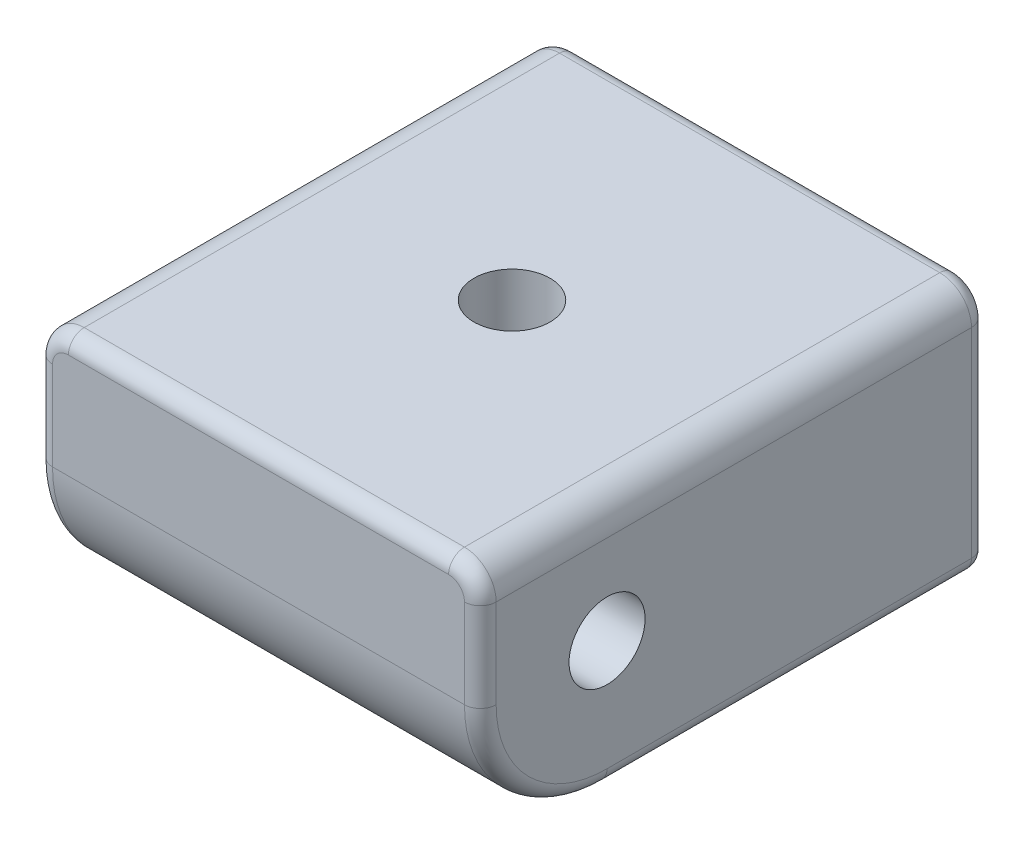
ISO-10303-21;
HEADER;
FILE_DESCRIPTION(('STEP AP214'),'2;1');
FILE_NAME('part.step','',(''),(''),'','','');
FILE_SCHEMA(('AUTOMOTIVE_DESIGN { 1 0 10303 214 1 1 1 1 }'));
ENDSEC;
DATA;
#1=APPLICATION_CONTEXT('core data for automotive mechanical design processes');
#2=APPLICATION_PROTOCOL_DEFINITION('international standard','automotive_design',2000,#1);
#3=PRODUCT_CONTEXT('',#1,'mechanical');
#4=PRODUCT('Part','Part','',(#3));
#5=PRODUCT_RELATED_PRODUCT_CATEGORY('part','',(#4));
#6=PRODUCT_DEFINITION_FORMATION('','',#4);
#7=PRODUCT_DEFINITION_CONTEXT('part definition',#1,'design');
#8=PRODUCT_DEFINITION('design','',#6,#7);
#9=PRODUCT_DEFINITION_SHAPE('','',#8);
#10=(LENGTH_UNIT() NAMED_UNIT(*) SI_UNIT(.MILLI.,.METRE.));
#11=(NAMED_UNIT(*) PLANE_ANGLE_UNIT() SI_UNIT($,.RADIAN.));
#12=(NAMED_UNIT(*) SI_UNIT($,.STERADIAN.) SOLID_ANGLE_UNIT());
#13=UNCERTAINTY_MEASURE_WITH_UNIT(LENGTH_MEASURE(1.E-05),#10,'distance_accuracy_value','');
#14=(GEOMETRIC_REPRESENTATION_CONTEXT(3) GLOBAL_UNCERTAINTY_ASSIGNED_CONTEXT((#13)) GLOBAL_UNIT_ASSIGNED_CONTEXT((#10,
#11,#12)) REPRESENTATION_CONTEXT('',''));
#15=CARTESIAN_POINT('',(0.,0.,0.));
#16=DIRECTION('',(0.,0.,1.));
#17=DIRECTION('',(1.,0.,0.));
#18=AXIS2_PLACEMENT_3D('',#15,#16,#17);
#19=CARTESIAN_POINT('',(-11.1125,10.8077,12.7));
#20=DIRECTION('',(1.,0.,0.));
#21=DIRECTION('',(0.,0.,-1.));
#22=AXIS2_PLACEMENT_3D('',#19,#20,#21);
#23=PLANE('',#22);
#24=CARTESIAN_POINT('',(-11.1125,6.34999999999999,19.05));
#25=DIRECTION('',(1.,0.,0.));
#26=DIRECTION('',(0.,0.,-1.));
#27=AXIS2_PLACEMENT_3D('',#24,#25,#26);
#28=CIRCLE('',#27,1.905);
#29=CARTESIAN_POINT('',(-11.1125,6.34999999999999,17.145));
#30=VERTEX_POINT('',#29);
#31=EDGE_CURVE('E430',#30,#30,#28,.F.);
#32=ORIENTED_EDGE('',*,*,#31,.F.);
#33=EDGE_LOOP('',(#32));
#34=FACE_BOUND('',#33,.T.);
#35=CARTESIAN_POINT('',(-11.1125,6.35,19.05));
#36=DIRECTION('',(1.,0.,0.));
#37=DIRECTION('',(0.,0.,-1.));
#38=AXIS2_PLACEMENT_3D('',#35,#36,#37);
#39=CIRCLE('',#38,5.55625);
#40=CARTESIAN_POINT('',(-11.1125,6.35,24.60625));
#41=VERTEX_POINT('',#40);
#42=CARTESIAN_POINT('',(-11.1125,0.793749999999999,19.05));
#43=VERTEX_POINT('',#42);
#44=EDGE_CURVE('E284',#41,#43,#39,.T.);
#45=ORIENTED_EDGE('',*,*,#44,.F.);
#46=DIRECTION('',(0.,-1.,0.));
#47=VECTOR('',#46,1.);
#48=CARTESIAN_POINT('',(-11.1125,10.8077,24.60625));
#49=LINE('',#48,#47);
#50=CARTESIAN_POINT('',(-11.1125,10.8077,24.60625));
#51=VERTEX_POINT('',#50);
#52=EDGE_CURVE('E327',#41,#51,#49,.F.);
#53=ORIENTED_EDGE('',*,*,#52,.T.);
#54=DIRECTION('',(0.,0.,-1.));
#55=VECTOR('',#54,1.);
#56=CARTESIAN_POINT('',(-11.1125,10.8077,12.7));
#57=LINE('',#56,#55);
#58=CARTESIAN_POINT('',(-11.1125,10.8077,0.793749999999999));
#59=VERTEX_POINT('',#58);
#60=EDGE_CURVE('E391',#51,#59,#57,.T.);
#61=ORIENTED_EDGE('',*,*,#60,.T.);
#62=DIRECTION('',(0.,-1.,0.));
#63=VECTOR('',#62,1.);
#64=CARTESIAN_POINT('',(-11.1125,10.8077,0.793749999999999));
#65=LINE('',#64,#63);
#66=CARTESIAN_POINT('',(-11.1125,0.79375,0.793749999999999));
#67=VERTEX_POINT('',#66);
#68=EDGE_CURVE('E322',#59,#67,#65,.T.);
#69=ORIENTED_EDGE('',*,*,#68,.T.);
#70=DIRECTION('',(0.,0.,-1.));
#71=VECTOR('',#70,1.);
#72=CARTESIAN_POINT('',(-11.1125,0.793749999999999,12.7));
#73=LINE('',#72,#71);
#74=EDGE_CURVE('E316',#67,#43,#73,.F.);
#75=ORIENTED_EDGE('',*,*,#74,.T.);
#76=EDGE_LOOP('',(#45,#53,#61,#69,#75));
#77=FACE_BOUND('',#76,.T.);
#78=ADVANCED_FACE('F49',(#34,#77),#23,.F.);
#79=CARTESIAN_POINT('',(11.1125,0.,12.7));
#80=DIRECTION('',(-1.,0.,0.));
#81=DIRECTION('',(0.,-1.,0.));
#82=AXIS2_PLACEMENT_3D('',#79,#80,#81);
#83=PLANE('',#82);
#84=CARTESIAN_POINT('',(11.1125,6.35,19.05));
#85=DIRECTION('',(1.,0.,0.));
#86=DIRECTION('',(0.,1.,0.));
#87=AXIS2_PLACEMENT_3D('',#84,#85,#86);
#88=CIRCLE('',#87,1.905);
#89=CARTESIAN_POINT('',(11.1125,8.255,19.05));
#90=VERTEX_POINT('',#89);
#91=EDGE_CURVE('E433',#90,#90,#88,.T.);
#92=ORIENTED_EDGE('',*,*,#91,.F.);
#93=EDGE_LOOP('',(#92));
#94=FACE_BOUND('',#93,.T.);
#95=CARTESIAN_POINT('',(11.1125,6.35,19.05));
#96=DIRECTION('',(-1.,0.,0.));
#97=DIRECTION('',(0.,-1.,0.));
#98=AXIS2_PLACEMENT_3D('',#95,#96,#97);
#99=CIRCLE('',#98,5.55625);
#100=CARTESIAN_POINT('',(11.1125,0.79375,19.05));
#101=VERTEX_POINT('',#100);
#102=CARTESIAN_POINT('',(11.1125,6.35,24.60625));
#103=VERTEX_POINT('',#102);
#104=EDGE_CURVE('E273',#101,#103,#99,.T.);
#105=ORIENTED_EDGE('',*,*,#104,.F.);
#106=DIRECTION('',(0.,0.,-1.));
#107=VECTOR('',#106,1.);
#108=CARTESIAN_POINT('',(11.1125,0.79375,12.7));
#109=LINE('',#108,#107);
#110=CARTESIAN_POINT('',(11.1125,0.79375,0.793749999999999));
#111=VERTEX_POINT('',#110);
#112=EDGE_CURVE('E401',#101,#111,#109,.T.);
#113=ORIENTED_EDGE('',*,*,#112,.T.);
#114=DIRECTION('',(0.,1.,0.));
#115=VECTOR('',#114,1.);
#116=CARTESIAN_POINT('',(11.1125,0.,0.793749999999999));
#117=LINE('',#116,#115);
#118=CARTESIAN_POINT('',(11.1125,10.8077,0.793749999999999));
#119=VERTEX_POINT('',#118);
#120=EDGE_CURVE('E404',#111,#119,#117,.T.);
#121=ORIENTED_EDGE('',*,*,#120,.T.);
#122=DIRECTION('',(0.,0.,-1.));
#123=VECTOR('',#122,1.);
#124=CARTESIAN_POINT('',(11.1125,10.8077,12.7));
#125=LINE('',#124,#123);
#126=CARTESIAN_POINT('',(11.1125,10.8077,24.60625));
#127=VERTEX_POINT('',#126);
#128=EDGE_CURVE('E215',#127,#119,#125,.T.);
#129=ORIENTED_EDGE('',*,*,#128,.F.);
#130=DIRECTION('',(0.,1.,0.));
#131=VECTOR('',#130,1.);
#132=CARTESIAN_POINT('',(11.1125,0.,24.60625));
#133=LINE('',#132,#131);
#134=EDGE_CURVE('E407',#127,#103,#133,.F.);
#135=ORIENTED_EDGE('',*,*,#134,.T.);
#136=EDGE_LOOP('',(#105,#113,#121,#129,#135));
#137=FACE_BOUND('',#136,.T.);
#138=ADVANCED_FACE('F459',(#94,#137),#83,.F.);
#139=CARTESIAN_POINT('',(9.525,10.8077,0.));
#140=DIRECTION('',(0.,0.,1.));
#141=DIRECTION('',(1.,0.,0.));
#142=AXIS2_PLACEMENT_3D('',#139,#140,#141);
#143=PLANE('',#142);
#144=DIRECTION('',(0.,1.,0.));
#145=VECTOR('',#144,1.);
#146=CARTESIAN_POINT('',(10.31875,10.8077,0.));
#147=LINE('',#146,#145);
#148=CARTESIAN_POINT('',(10.31875,10.8077,0.));
#149=VERTEX_POINT('',#148);
#150=CARTESIAN_POINT('',(10.31875,0.79375,0.));
#151=VERTEX_POINT('',#150);
#152=EDGE_CURVE('E354',#149,#151,#147,.F.);
#153=ORIENTED_EDGE('',*,*,#152,.T.);
#154=DIRECTION('',(1.,0.,0.));
#155=VECTOR('',#154,1.);
#156=CARTESIAN_POINT('',(9.525,0.793749999999999,0.));
#157=LINE('',#156,#155);
#158=CARTESIAN_POINT('',(-10.31875,0.79375,0.));
#159=VERTEX_POINT('',#158);
#160=EDGE_CURVE('E358',#151,#159,#157,.F.);
#161=ORIENTED_EDGE('',*,*,#160,.T.);
#162=DIRECTION('',(0.,-1.,0.));
#163=VECTOR('',#162,1.);
#164=CARTESIAN_POINT('',(-10.31875,10.8077,0.));
#165=LINE('',#164,#163);
#166=CARTESIAN_POINT('',(-10.31875,10.8077,0.));
#167=VERTEX_POINT('',#166);
#168=EDGE_CURVE('E348',#159,#167,#165,.F.);
#169=ORIENTED_EDGE('',*,*,#168,.T.);
#170=CARTESIAN_POINT('',(-9.525,10.8077,0.));
#171=DIRECTION('',(0.,0.,1.));
#172=DIRECTION('',(1.,0.,0.));
#173=AXIS2_PLACEMENT_3D('',#170,#171,#172);
#174=CIRCLE('',#173,0.79375);
#175=CARTESIAN_POINT('',(-9.52499999999999,11.60145,0.));
#176=VERTEX_POINT('',#175);
#177=EDGE_CURVE('E345',#167,#176,#174,.F.);
#178=ORIENTED_EDGE('',*,*,#177,.T.);
#179=DIRECTION('',(-1.,0.,0.));
#180=VECTOR('',#179,1.);
#181=CARTESIAN_POINT('',(9.525,11.60145,0.));
#182=LINE('',#181,#180);
#183=CARTESIAN_POINT('',(9.52499999999999,11.60145,0.));
#184=VERTEX_POINT('',#183);
#185=EDGE_CURVE('E342',#176,#184,#182,.F.);
#186=ORIENTED_EDGE('',*,*,#185,.T.);
#187=CARTESIAN_POINT('',(9.525,10.8077,0.));
#188=DIRECTION('',(0.,0.,1.));
#189=DIRECTION('',(1.,0.,0.));
#190=AXIS2_PLACEMENT_3D('',#187,#188,#189);
#191=CIRCLE('',#190,0.79375);
#192=EDGE_CURVE('E351',#184,#149,#191,.F.);
#193=ORIENTED_EDGE('',*,*,#192,.T.);
#194=EDGE_LOOP('',(#153,#161,#169,#178,#186,#193));
#195=FACE_BOUND('',#194,.T.);
#196=CARTESIAN_POINT('',(-6.35,6.35,0.));
#197=DIRECTION('',(0.,0.,1.));
#198=DIRECTION('',(1.,0.,0.));
#199=AXIS2_PLACEMENT_3D('',#196,#197,#198);
#200=CIRCLE('',#199,1.905);
#201=CARTESIAN_POINT('',(-4.445,6.35,0.));
#202=VERTEX_POINT('',#201);
#203=EDGE_CURVE('E413',#202,#202,#200,.T.);
#204=ORIENTED_EDGE('',*,*,#203,.T.);
#205=EDGE_LOOP('',(#204));
#206=FACE_BOUND('',#205,.T.);
#207=CARTESIAN_POINT('',(6.35,6.35,0.));
#208=DIRECTION('',(0.,0.,1.));
#209=DIRECTION('',(1.,0.,0.));
#210=AXIS2_PLACEMENT_3D('',#207,#208,#209);
#211=CIRCLE('',#210,1.905);
#212=CARTESIAN_POINT('',(8.255,6.35,0.));
#213=VERTEX_POINT('',#212);
#214=EDGE_CURVE('E411',#213,#213,#211,.T.);
#215=ORIENTED_EDGE('',*,*,#214,.T.);
#216=EDGE_LOOP('',(#215));
#217=FACE_BOUND('',#216,.T.);
#218=ADVANCED_FACE('F456',(#195,#206,#217),#143,.F.);
#219=CARTESIAN_POINT('',(9.525,10.8077,12.7));
#220=DIRECTION('',(0.,0.,-1.));
#221=DIRECTION('',(-1.,0.,0.));
#222=AXIS2_PLACEMENT_3D('',#219,#220,#221);
#223=CYLINDRICAL_SURFACE('',#222,1.5875);
#224=DIRECTION('',(0.,0.,-1.));
#225=VECTOR('',#224,1.);
#226=CARTESIAN_POINT('',(9.52499999999998,12.3952,12.7));
#227=LINE('',#226,#225);
#228=CARTESIAN_POINT('',(9.52499999999998,12.3952,24.60625));
#229=VERTEX_POINT('',#228);
#230=CARTESIAN_POINT('',(9.52499999999998,12.3952,0.793749999999999));
#231=VERTEX_POINT('',#230);
#232=EDGE_CURVE('E376',#229,#231,#227,.T.);
#233=ORIENTED_EDGE('',*,*,#232,.F.);
#234=CARTESIAN_POINT('',(9.525,10.8077,24.60625));
#235=DIRECTION('',(0.,0.,1.));
#236=DIRECTION('',(1.,0.,0.));
#237=AXIS2_PLACEMENT_3D('',#234,#235,#236);
#238=CIRCLE('',#237,1.5875);
#239=EDGE_CURVE('E218',#229,#127,#238,.F.);
#240=ORIENTED_EDGE('',*,*,#239,.T.);
#241=ORIENTED_EDGE('',*,*,#128,.T.);
#242=CARTESIAN_POINT('',(9.525,10.8077,0.793749999999999));
#243=DIRECTION('',(0.,0.,1.));
#244=DIRECTION('',(1.,0.,0.));
#245=AXIS2_PLACEMENT_3D('',#242,#243,#244);
#246=CIRCLE('',#245,1.5875);
#247=EDGE_CURVE('E330',#119,#231,#246,.T.);
#248=ORIENTED_EDGE('',*,*,#247,.T.);
#249=EDGE_LOOP('',(#233,#240,#241,#248));
#250=FACE_BOUND('',#249,.T.);
#251=ADVANCED_FACE('F381',(#250),#223,.T.);
#252=CARTESIAN_POINT('',(9.52499999999998,12.3952,12.7));
#253=DIRECTION('',(0.,-1.,0.));
#254=DIRECTION('',(1.,0.,0.));
#255=AXIS2_PLACEMENT_3D('',#252,#253,#254);
#256=PLANE('',#255);
#257=CARTESIAN_POINT('',(0.,12.3952,12.7));
#258=DIRECTION('',(0.,1.,0.));
#259=DIRECTION('',(-1.,0.,0.));
#260=AXIS2_PLACEMENT_3D('',#257,#258,#259);
#261=CIRCLE('',#260,1.905);
#262=CARTESIAN_POINT('',(-1.905,12.3952,12.7));
#263=VERTEX_POINT('',#262);
#264=EDGE_CURVE('E272',#263,#263,#261,.T.);
#265=ORIENTED_EDGE('',*,*,#264,.F.);
#266=EDGE_LOOP('',(#265));
#267=FACE_BOUND('',#266,.T.);
#268=DIRECTION('',(0.,0.,-1.));
#269=VECTOR('',#268,1.);
#270=CARTESIAN_POINT('',(-9.52499999999999,12.3952,12.7));
#271=LINE('',#270,#269);
#272=CARTESIAN_POINT('',(-9.52499999999999,12.3952,24.60625));
#273=VERTEX_POINT('',#272);
#274=CARTESIAN_POINT('',(-9.52499999999999,12.3952,0.793749999999999));
#275=VERTEX_POINT('',#274);
#276=EDGE_CURVE('E379',#273,#275,#271,.T.);
#277=ORIENTED_EDGE('',*,*,#276,.F.);
#278=DIRECTION('',(-1.,0.,0.));
#279=VECTOR('',#278,1.);
#280=CARTESIAN_POINT('',(9.52499999999998,12.3952,24.60625));
#281=LINE('',#280,#279);
#282=EDGE_CURVE('E278',#273,#229,#281,.F.);
#283=ORIENTED_EDGE('',*,*,#282,.T.);
#284=ORIENTED_EDGE('',*,*,#232,.T.);
#285=DIRECTION('',(-1.,0.,0.));
#286=VECTOR('',#285,1.);
#287=CARTESIAN_POINT('',(9.52499999999998,12.3952,0.793749999999999));
#288=LINE('',#287,#286);
#289=EDGE_CURVE('E368',#231,#275,#288,.T.);
#290=ORIENTED_EDGE('',*,*,#289,.T.);
#291=EDGE_LOOP('',(#277,#283,#284,#290));
#292=FACE_BOUND('',#291,.T.);
#293=ADVANCED_FACE('F375',(#267,#292),#256,.F.);
#294=CARTESIAN_POINT('',(-9.525,10.8077,12.7));
#295=DIRECTION('',(0.,0.,-1.));
#296=DIRECTION('',(-1.,0.,0.));
#297=AXIS2_PLACEMENT_3D('',#294,#295,#296);
#298=CYLINDRICAL_SURFACE('',#297,1.5875);
#299=ORIENTED_EDGE('',*,*,#60,.F.);
#300=CARTESIAN_POINT('',(-9.525,10.8077,24.60625));
#301=DIRECTION('',(0.,0.,1.));
#302=DIRECTION('',(1.,0.,0.));
#303=AXIS2_PLACEMENT_3D('',#300,#301,#302);
#304=CIRCLE('',#303,1.5875);
#305=EDGE_CURVE('E339',#51,#273,#304,.F.);
#306=ORIENTED_EDGE('',*,*,#305,.T.);
#307=ORIENTED_EDGE('',*,*,#276,.T.);
#308=CARTESIAN_POINT('',(-9.525,10.8077,0.793749999999999));
#309=DIRECTION('',(0.,0.,1.));
#310=DIRECTION('',(1.,0.,0.));
#311=AXIS2_PLACEMENT_3D('',#308,#309,#310);
#312=CIRCLE('',#311,1.5875);
#313=EDGE_CURVE('E336',#275,#59,#312,.T.);
#314=ORIENTED_EDGE('',*,*,#313,.T.);
#315=EDGE_LOOP('',(#299,#306,#307,#314));
#316=FACE_BOUND('',#315,.T.);
#317=ADVANCED_FACE('F446',(#316),#298,.T.);
#318=CARTESIAN_POINT('',(-11.1125,0.,12.7));
#319=DIRECTION('',(0.,1.,0.));
#320=DIRECTION('',(0.,0.,1.));
#321=AXIS2_PLACEMENT_3D('',#318,#319,#320);
#322=PLANE('',#321);
#323=DIRECTION('',(0.,0.,-1.));
#324=VECTOR('',#323,1.);
#325=CARTESIAN_POINT('',(10.31875,0.,12.7));
#326=LINE('',#325,#324);
#327=CARTESIAN_POINT('',(10.31875,0.,0.793749999999999));
#328=VERTEX_POINT('',#327);
#329=CARTESIAN_POINT('',(10.31875,0.,19.05));
#330=VERTEX_POINT('',#329);
#331=EDGE_CURVE('E361',#328,#330,#326,.F.);
#332=ORIENTED_EDGE('',*,*,#331,.T.);
#333=DIRECTION('',(1.,0.,0.));
#334=VECTOR('',#333,1.);
#335=CARTESIAN_POINT('',(-10.31875,0.,19.05));
#336=LINE('',#335,#334);
#337=CARTESIAN_POINT('',(-10.31875,0.,19.05));
#338=VERTEX_POINT('',#337);
#339=EDGE_CURVE('E12',#330,#338,#336,.F.);
#340=ORIENTED_EDGE('',*,*,#339,.T.);
#341=DIRECTION('',(0.,0.,-1.));
#342=VECTOR('',#341,1.);
#343=CARTESIAN_POINT('',(-10.31875,0.,12.7));
#344=LINE('',#343,#342);
#345=CARTESIAN_POINT('',(-10.31875,0.,0.793749999999999));
#346=VERTEX_POINT('',#345);
#347=EDGE_CURVE('E318',#338,#346,#344,.T.);
#348=ORIENTED_EDGE('',*,*,#347,.T.);
#349=DIRECTION('',(1.,0.,0.));
#350=VECTOR('',#349,1.);
#351=CARTESIAN_POINT('',(-11.1125,0.,0.793749999999999));
#352=LINE('',#351,#350);
#353=EDGE_CURVE('E364',#346,#328,#352,.T.);
#354=ORIENTED_EDGE('',*,*,#353,.T.);
#355=EDGE_LOOP('',(#332,#340,#348,#354));
#356=FACE_BOUND('',#355,.T.);
#357=ADVANCED_FACE('F452',(#356),#322,.F.);
#358=CARTESIAN_POINT('',(-6.35,6.35,12.7));
#359=DIRECTION('',(0.,0.,-1.));
#360=DIRECTION('',(-1.,0.,0.));
#361=AXIS2_PLACEMENT_3D('',#358,#359,#360);
#362=CYLINDRICAL_SURFACE('',#361,1.905);
#363=CARTESIAN_POINT('',(-6.35,6.35,12.7));
#364=DIRECTION('',(0.,0.,1.));
#365=DIRECTION('',(1.,0.,0.));
#366=AXIS2_PLACEMENT_3D('',#363,#364,#365);
#367=CIRCLE('',#366,1.905);
#368=CARTESIAN_POINT('',(-4.445,6.35,12.7));
#369=VERTEX_POINT('',#368);
#370=EDGE_CURVE('E414',#369,#369,#367,.T.);
#371=ORIENTED_EDGE('',*,*,#370,.T.);
#372=EDGE_LOOP('',(#371));
#373=FACE_BOUND('',#372,.T.);
#374=ORIENTED_EDGE('',*,*,#203,.F.);
#375=EDGE_LOOP('',(#374));
#376=FACE_BOUND('',#375,.T.);
#377=ADVANCED_FACE('F471',(#373,#376),#362,.F.);
#378=CARTESIAN_POINT('',(6.35,6.35,12.7));
#379=DIRECTION('',(0.,0.,-1.));
#380=DIRECTION('',(-1.,0.,0.));
#381=AXIS2_PLACEMENT_3D('',#378,#379,#380);
#382=CYLINDRICAL_SURFACE('',#381,1.905);
#383=CARTESIAN_POINT('',(6.35,6.35,12.7));
#384=DIRECTION('',(0.,0.,1.));
#385=DIRECTION('',(1.,0.,0.));
#386=AXIS2_PLACEMENT_3D('',#383,#384,#385);
#387=CIRCLE('',#386,1.905);
#388=CARTESIAN_POINT('',(8.255,6.35,12.7));
#389=VERTEX_POINT('',#388);
#390=EDGE_CURVE('E425',#389,#389,#387,.T.);
#391=ORIENTED_EDGE('',*,*,#390,.T.);
#392=EDGE_LOOP('',(#391));
#393=FACE_BOUND('',#392,.T.);
#394=ORIENTED_EDGE('',*,*,#214,.F.);
#395=EDGE_LOOP('',(#394));
#396=FACE_BOUND('',#395,.T.);
#397=ADVANCED_FACE('F477',(#393,#396),#382,.F.);
#398=CARTESIAN_POINT('',(9.525,10.8077,12.7));
#399=DIRECTION('',(0.,0.,1.));
#400=DIRECTION('',(1.,0.,0.));
#401=AXIS2_PLACEMENT_3D('',#398,#399,#400);
#402=PLANE('',#401);
#403=ORIENTED_EDGE('',*,*,#390,.F.);
#404=EDGE_LOOP('',(#403));
#405=FACE_BOUND('',#404,.T.);
#406=ADVANCED_FACE('F481',(#405),#402,.F.);
#407=ORIENTED_EDGE('',*,*,#370,.F.);
#408=EDGE_LOOP('',(#407));
#409=FACE_BOUND('',#408,.T.);
#410=ADVANCED_FACE('F483',(#409),#402,.F.);
#411=CARTESIAN_POINT('',(9.525,10.8077,25.4));
#412=DIRECTION('',(0.,0.,1.));
#413=DIRECTION('',(1.,0.,0.));
#414=AXIS2_PLACEMENT_3D('',#411,#412,#413);
#415=PLANE('',#414);
#416=DIRECTION('',(0.,-1.,0.));
#417=VECTOR('',#416,1.);
#418=CARTESIAN_POINT('',(-10.31875,0.,25.4));
#419=LINE('',#418,#417);
#420=CARTESIAN_POINT('',(-10.31875,10.8077,25.4));
#421=VERTEX_POINT('',#420);
#422=CARTESIAN_POINT('',(-10.31875,6.35,25.4));
#423=VERTEX_POINT('',#422);
#424=EDGE_CURVE('E202',#421,#423,#419,.T.);
#425=ORIENTED_EDGE('',*,*,#424,.T.);
#426=DIRECTION('',(1.,0.,0.));
#427=VECTOR('',#426,1.);
#428=CARTESIAN_POINT('',(10.31875,6.35,25.4));
#429=LINE('',#428,#427);
#430=CARTESIAN_POINT('',(10.31875,6.35,25.4));
#431=VERTEX_POINT('',#430);
#432=EDGE_CURVE('E59',#423,#431,#429,.T.);
#433=ORIENTED_EDGE('',*,*,#432,.T.);
#434=DIRECTION('',(0.,1.,0.));
#435=VECTOR('',#434,1.);
#436=CARTESIAN_POINT('',(10.31875,10.8077,25.4));
#437=LINE('',#436,#435);
#438=CARTESIAN_POINT('',(10.31875,10.8077,25.4));
#439=VERTEX_POINT('',#438);
#440=EDGE_CURVE('E196',#431,#439,#437,.T.);
#441=ORIENTED_EDGE('',*,*,#440,.T.);
#442=CARTESIAN_POINT('',(9.525,10.8077,25.4));
#443=DIRECTION('',(0.,0.,1.));
#444=DIRECTION('',(1.,0.,0.));
#445=AXIS2_PLACEMENT_3D('',#442,#443,#444);
#446=CIRCLE('',#445,0.79375);
#447=CARTESIAN_POINT('',(9.52499999999999,11.60145,25.4));
#448=VERTEX_POINT('',#447);
#449=EDGE_CURVE('E190',#439,#448,#446,.T.);
#450=ORIENTED_EDGE('',*,*,#449,.T.);
#451=DIRECTION('',(-1.,0.,0.));
#452=VECTOR('',#451,1.);
#453=CARTESIAN_POINT('',(-9.52499999999999,11.60145,25.4));
#454=LINE('',#453,#452);
#455=CARTESIAN_POINT('',(-9.52499999999999,11.60145,25.4));
#456=VERTEX_POINT('',#455);
#457=EDGE_CURVE('E193',#448,#456,#454,.T.);
#458=ORIENTED_EDGE('',*,*,#457,.T.);
#459=CARTESIAN_POINT('',(-9.525,10.8077,25.4));
#460=DIRECTION('',(0.,0.,1.));
#461=DIRECTION('',(1.,0.,0.));
#462=AXIS2_PLACEMENT_3D('',#459,#460,#461);
#463=CIRCLE('',#462,0.79375);
#464=EDGE_CURVE('E214',#456,#421,#463,.T.);
#465=ORIENTED_EDGE('',*,*,#464,.T.);
#466=EDGE_LOOP('',(#425,#433,#441,#450,#458,#465));
#467=FACE_BOUND('',#466,.T.);
#468=ADVANCED_FACE('F192',(#467),#415,.T.);
#469=CARTESIAN_POINT('',(-11.1135,6.34999999999999,19.05));
#470=DIRECTION('',(1.,0.,0.));
#471=DIRECTION('',(0.,1.,0.));
#472=AXIS2_PLACEMENT_3D('',#469,#470,#471);
#473=CYLINDRICAL_SURFACE('',#472,1.905);
#474=ORIENTED_EDGE('',*,*,#91,.T.);
#475=EDGE_LOOP('',(#474));
#476=FACE_BOUND('',#475,.T.);
#477=ORIENTED_EDGE('',*,*,#31,.T.);
#478=EDGE_LOOP('',(#477));
#479=FACE_BOUND('',#478,.T.);
#480=ADVANCED_FACE('F489',(#476,#479),#473,.F.);
#481=CARTESIAN_POINT('',(0.,-5.38815367264149,12.7));
#482=DIRECTION('',(0.,1.,0.));
#483=DIRECTION('',(-1.,0.,0.));
#484=AXIS2_PLACEMENT_3D('',#481,#482,#483);
#485=CYLINDRICAL_SURFACE('',#484,1.905);
#486=CARTESIAN_POINT('',(0.,1.5875,12.7));
#487=DIRECTION('',(0.,1.,0.));
#488=DIRECTION('',(0.,0.,1.));
#489=AXIS2_PLACEMENT_3D('',#486,#487,#488);
#490=CIRCLE('',#489,1.905);
#491=CARTESIAN_POINT('',(0.,1.5875,14.605));
#492=VERTEX_POINT('',#491);
#493=EDGE_CURVE('E436',#492,#492,#490,.F.);
#494=ORIENTED_EDGE('',*,*,#493,.T.);
#495=EDGE_LOOP('',(#494));
#496=FACE_BOUND('',#495,.T.);
#497=ORIENTED_EDGE('',*,*,#264,.T.);
#498=EDGE_LOOP('',(#497));
#499=FACE_BOUND('',#498,.T.);
#500=ADVANCED_FACE('F443',(#496,#499),#485,.F.);
#501=CARTESIAN_POINT('',(-11.1125,1.5875,12.7));
#502=DIRECTION('',(0.,1.,0.));
#503=DIRECTION('',(0.,0.,1.));
#504=AXIS2_PLACEMENT_3D('',#501,#502,#503);
#505=PLANE('',#504);
#506=ORIENTED_EDGE('',*,*,#493,.F.);
#507=EDGE_LOOP('',(#506));
#508=FACE_BOUND('',#507,.T.);
#509=ADVANCED_FACE('F494',(#508),#505,.T.);
#510=CARTESIAN_POINT('',(-9.525,10.8077,0.793749999999999));
#511=DIRECTION('',(0.,0.,1.));
#512=DIRECTION('',(1.,0.,0.));
#513=AXIS2_PLACEMENT_3D('',#510,#511,#512);
#514=DEGENERATE_TOROIDAL_SURFACE('',#513,0.79375,0.79375,.T.);
#515=CARTESIAN_POINT('',(-10.31875,10.8077,0.793749999999999));
#516=DIRECTION('',(0.,-1.,0.));
#517=DIRECTION('',(0.,0.,-1.));
#518=AXIS2_PLACEMENT_3D('',#515,#516,#517);
#519=CIRCLE('',#518,0.79375);
#520=EDGE_CURVE('E264',#59,#167,#519,.T.);
#521=ORIENTED_EDGE('',*,*,#520,.F.);
#522=ORIENTED_EDGE('',*,*,#313,.F.);
#523=CARTESIAN_POINT('',(-9.52499999999999,11.60145,0.79375));
#524=DIRECTION('',(1.,0.,0.));
#525=DIRECTION('',(0.,1.,0.));
#526=AXIS2_PLACEMENT_3D('',#523,#524,#525);
#527=CIRCLE('',#526,0.79375);
#528=EDGE_CURVE('E268',#176,#275,#527,.T.);
#529=ORIENTED_EDGE('',*,*,#528,.F.);
#530=ORIENTED_EDGE('',*,*,#177,.F.);
#531=EDGE_LOOP('',(#521,#522,#529,#530));
#532=FACE_BOUND('',#531,.T.);
#533=ADVANCED_FACE('F497',(#532),#514,.T.);
#534=CARTESIAN_POINT('',(9.52499999999998,11.60145,0.793749999999999));
#535=DIRECTION('',(-1.,0.,0.));
#536=DIRECTION('',(0.,-1.,0.));
#537=AXIS2_PLACEMENT_3D('',#534,#535,#536);
#538=CYLINDRICAL_SURFACE('',#537,0.79375);
#539=ORIENTED_EDGE('',*,*,#528,.T.);
#540=ORIENTED_EDGE('',*,*,#289,.F.);
#541=CARTESIAN_POINT('',(9.52499999999999,11.60145,0.79375));
#542=DIRECTION('',(1.,0.,0.));
#543=DIRECTION('',(0.,1.,0.));
#544=AXIS2_PLACEMENT_3D('',#541,#542,#543);
#545=CIRCLE('',#544,0.79375);
#546=EDGE_CURVE('E260',#184,#231,#545,.T.);
#547=ORIENTED_EDGE('',*,*,#546,.F.);
#548=ORIENTED_EDGE('',*,*,#185,.F.);
#549=EDGE_LOOP('',(#539,#540,#547,#548));
#550=FACE_BOUND('',#549,.T.);
#551=ADVANCED_FACE('F504',(#550),#538,.T.);
#552=CARTESIAN_POINT('',(-10.31875,10.8077,0.793749999999999));
#553=DIRECTION('',(0.,-1.,0.));
#554=DIRECTION('',(0.,0.,-1.));
#555=AXIS2_PLACEMENT_3D('',#552,#553,#554);
#556=CYLINDRICAL_SURFACE('',#555,0.79375);
#557=ORIENTED_EDGE('',*,*,#520,.T.);
#558=ORIENTED_EDGE('',*,*,#168,.F.);
#559=CARTESIAN_POINT('',(-10.31875,0.79375,0.793749999999999));
#560=DIRECTION('',(0.,-1.,0.));
#561=DIRECTION('',(0.,0.,-1.));
#562=AXIS2_PLACEMENT_3D('',#559,#560,#561);
#563=CIRCLE('',#562,0.79375);
#564=EDGE_CURVE('E256',#67,#159,#563,.T.);
#565=ORIENTED_EDGE('',*,*,#564,.F.);
#566=ORIENTED_EDGE('',*,*,#68,.F.);
#567=EDGE_LOOP('',(#557,#558,#565,#566));
#568=FACE_BOUND('',#567,.T.);
#569=ADVANCED_FACE('F512',(#568),#556,.T.);
#570=CARTESIAN_POINT('',(-10.31875,0.79375,12.7));
#571=DIRECTION('',(0.,0.,-1.));
#572=DIRECTION('',(-1.,0.,0.));
#573=AXIS2_PLACEMENT_3D('',#570,#571,#572);
#574=CYLINDRICAL_SURFACE('',#573,0.79375);
#575=ORIENTED_EDGE('',*,*,#347,.F.);
#576=CARTESIAN_POINT('',(-10.31875,0.79375,19.05));
#577=DIRECTION('',(0.,0.,-1.));
#578=DIRECTION('',(-1.,0.,0.));
#579=AXIS2_PLACEMENT_3D('',#576,#577,#578);
#580=CIRCLE('',#579,0.79375);
#581=EDGE_CURVE('E281',#338,#43,#580,.T.);
#582=ORIENTED_EDGE('',*,*,#581,.T.);
#583=ORIENTED_EDGE('',*,*,#74,.F.);
#584=CARTESIAN_POINT('',(-10.31875,0.79375,0.793749999999999));
#585=DIRECTION('',(0.,0.,-1.));
#586=DIRECTION('',(-1.,0.,0.));
#587=AXIS2_PLACEMENT_3D('',#584,#585,#586);
#588=CIRCLE('',#587,0.79375);
#589=EDGE_CURVE('E252',#346,#67,#588,.T.);
#590=ORIENTED_EDGE('',*,*,#589,.F.);
#591=EDGE_LOOP('',(#575,#582,#583,#590));
#592=FACE_BOUND('',#591,.T.);
#593=ADVANCED_FACE('F314',(#592),#574,.T.);
#594=CARTESIAN_POINT('',(9.525,10.8077,0.793749999999999));
#595=DIRECTION('',(0.,0.,1.));
#596=DIRECTION('',(1.,0.,0.));
#597=AXIS2_PLACEMENT_3D('',#594,#595,#596);
#598=DEGENERATE_TOROIDAL_SURFACE('',#597,0.79375,0.79375,.T.);
#599=ORIENTED_EDGE('',*,*,#546,.T.);
#600=ORIENTED_EDGE('',*,*,#247,.F.);
#601=CARTESIAN_POINT('',(10.31875,10.8077,0.79375));
#602=DIRECTION('',(0.,-1.,0.));
#603=DIRECTION('',(0.,0.,-1.));
#604=AXIS2_PLACEMENT_3D('',#601,#602,#603);
#605=CIRCLE('',#604,0.79375);
#606=EDGE_CURVE('E248',#149,#119,#605,.T.);
#607=ORIENTED_EDGE('',*,*,#606,.F.);
#608=ORIENTED_EDGE('',*,*,#192,.F.);
#609=EDGE_LOOP('',(#599,#600,#607,#608));
#610=FACE_BOUND('',#609,.T.);
#611=ADVANCED_FACE('F561',(#610),#598,.T.);
#612=CARTESIAN_POINT('',(-10.31875,0.79375,0.79375));
#613=DIRECTION('',(-1.,0.,0.));
#614=DIRECTION('',(0.,0.,1.));
#615=AXIS2_PLACEMENT_3D('',#612,#613,#614);
#616=SPHERICAL_SURFACE('',#615,0.79375);
#617=ORIENTED_EDGE('',*,*,#589,.T.);
#618=ORIENTED_EDGE('',*,*,#564,.T.);
#619=CARTESIAN_POINT('',(-10.31875,0.79375,0.79375));
#620=DIRECTION('',(-1.,0.,0.));
#621=DIRECTION('',(0.,0.,1.));
#622=AXIS2_PLACEMENT_3D('',#619,#620,#621);
#623=CIRCLE('',#622,0.79375);
#624=EDGE_CURVE('E244',#346,#159,#623,.F.);
#625=ORIENTED_EDGE('',*,*,#624,.F.);
#626=EDGE_LOOP('',(#617,#618,#625));
#627=FACE_BOUND('',#626,.T.);
#628=ADVANCED_FACE('F558',(#627),#616,.T.);
#629=CARTESIAN_POINT('',(-10.31875,10.8077,24.60625));
#630=DIRECTION('',(0.,1.,0.));
#631=DIRECTION('',(0.,0.,1.));
#632=AXIS2_PLACEMENT_3D('',#629,#630,#631);
#633=CYLINDRICAL_SURFACE('',#632,0.79375);
#634=ORIENTED_EDGE('',*,*,#52,.F.);
#635=CARTESIAN_POINT('',(-10.31875,6.35,24.60625));
#636=DIRECTION('',(0.,1.,0.));
#637=DIRECTION('',(0.,0.,1.));
#638=AXIS2_PLACEMENT_3D('',#635,#636,#637);
#639=CIRCLE('',#638,0.79375);
#640=EDGE_CURVE('E81',#41,#423,#639,.T.);
#641=ORIENTED_EDGE('',*,*,#640,.T.);
#642=ORIENTED_EDGE('',*,*,#424,.F.);
#643=CARTESIAN_POINT('',(-10.31875,10.8077,24.60625));
#644=DIRECTION('',(0.,1.,0.));
#645=DIRECTION('',(0.,0.,1.));
#646=AXIS2_PLACEMENT_3D('',#643,#644,#645);
#647=CIRCLE('',#646,0.79375);
#648=EDGE_CURVE('E240',#51,#421,#647,.T.);
#649=ORIENTED_EDGE('',*,*,#648,.F.);
#650=EDGE_LOOP('',(#634,#641,#642,#649));
#651=FACE_BOUND('',#650,.T.);
#652=ADVANCED_FACE('F554',(#651),#633,.T.);
#653=CARTESIAN_POINT('',(10.31875,0.,0.793749999999999));
#654=DIRECTION('',(0.,1.,0.));
#655=DIRECTION('',(-1.,0.,0.));
#656=AXIS2_PLACEMENT_3D('',#653,#654,#655);
#657=CYLINDRICAL_SURFACE('',#656,0.79375);
#658=ORIENTED_EDGE('',*,*,#606,.T.);
#659=ORIENTED_EDGE('',*,*,#120,.F.);
#660=CARTESIAN_POINT('',(10.31875,0.79375,0.79375));
#661=DIRECTION('',(0.,-1.,0.));
#662=DIRECTION('',(1.,0.,0.));
#663=AXIS2_PLACEMENT_3D('',#660,#661,#662);
#664=CIRCLE('',#663,0.79375);
#665=EDGE_CURVE('E236',#151,#111,#664,.T.);
#666=ORIENTED_EDGE('',*,*,#665,.F.);
#667=ORIENTED_EDGE('',*,*,#152,.F.);
#668=EDGE_LOOP('',(#658,#659,#666,#667));
#669=FACE_BOUND('',#668,.T.);
#670=ADVANCED_FACE('F550',(#669),#657,.T.);
#671=CARTESIAN_POINT('',(-11.1125,0.79375,0.793749999999999));
#672=DIRECTION('',(1.,0.,0.));
#673=DIRECTION('',(0.,0.,-1.));
#674=AXIS2_PLACEMENT_3D('',#671,#672,#673);
#675=CYLINDRICAL_SURFACE('',#674,0.79375);
#676=ORIENTED_EDGE('',*,*,#624,.T.);
#677=ORIENTED_EDGE('',*,*,#160,.F.);
#678=CARTESIAN_POINT('',(10.31875,0.79375,0.793749999999999));
#679=DIRECTION('',(1.,0.,0.));
#680=DIRECTION('',(0.,0.,-1.));
#681=AXIS2_PLACEMENT_3D('',#678,#679,#680);
#682=CIRCLE('',#681,0.79375);
#683=EDGE_CURVE('E233',#328,#151,#682,.T.);
#684=ORIENTED_EDGE('',*,*,#683,.F.);
#685=ORIENTED_EDGE('',*,*,#353,.F.);
#686=EDGE_LOOP('',(#676,#677,#684,#685));
#687=FACE_BOUND('',#686,.T.);
#688=ADVANCED_FACE('F547',(#687),#675,.T.);
#689=CARTESIAN_POINT('',(-9.525,10.8077,24.60625));
#690=DIRECTION('',(0.,0.,1.));
#691=DIRECTION('',(1.,0.,0.));
#692=AXIS2_PLACEMENT_3D('',#689,#690,#691);
#693=DEGENERATE_TOROIDAL_SURFACE('',#692,0.79375,0.79375,.T.);
#694=ORIENTED_EDGE('',*,*,#648,.T.);
#695=ORIENTED_EDGE('',*,*,#464,.F.);
#696=CARTESIAN_POINT('',(-9.52499999999999,11.60145,24.60625));
#697=DIRECTION('',(1.,0.,0.));
#698=DIRECTION('',(0.,1.,0.));
#699=AXIS2_PLACEMENT_3D('',#696,#697,#698);
#700=CIRCLE('',#699,0.79375);
#701=EDGE_CURVE('E212',#273,#456,#700,.T.);
#702=ORIENTED_EDGE('',*,*,#701,.F.);
#703=ORIENTED_EDGE('',*,*,#305,.F.);
#704=EDGE_LOOP('',(#694,#695,#702,#703));
#705=FACE_BOUND('',#704,.T.);
#706=ADVANCED_FACE('F543',(#705),#693,.T.);
#707=CARTESIAN_POINT('',(10.31875,0.79375,0.79375));
#708=DIRECTION('',(0.,0.,-1.));
#709=DIRECTION('',(-1.,0.,0.));
#710=AXIS2_PLACEMENT_3D('',#707,#708,#709);
#711=SPHERICAL_SURFACE('',#710,0.79375);
#712=ORIENTED_EDGE('',*,*,#683,.T.);
#713=ORIENTED_EDGE('',*,*,#665,.T.);
#714=CARTESIAN_POINT('',(10.31875,0.79375,0.793749999999999));
#715=DIRECTION('',(0.,0.,-1.));
#716=DIRECTION('',(-1.,0.,0.));
#717=AXIS2_PLACEMENT_3D('',#714,#715,#716);
#718=CIRCLE('',#717,0.79375);
#719=EDGE_CURVE('E220',#328,#111,#718,.F.);
#720=ORIENTED_EDGE('',*,*,#719,.F.);
#721=EDGE_LOOP('',(#712,#713,#720));
#722=FACE_BOUND('',#721,.T.);
#723=ADVANCED_FACE('F540',(#722),#711,.T.);
#724=CARTESIAN_POINT('',(9.525,11.60145,24.60625));
#725=DIRECTION('',(1.,0.,0.));
#726=DIRECTION('',(0.,1.,0.));
#727=AXIS2_PLACEMENT_3D('',#724,#725,#726);
#728=CYLINDRICAL_SURFACE('',#727,0.79375);
#729=ORIENTED_EDGE('',*,*,#701,.T.);
#730=ORIENTED_EDGE('',*,*,#457,.F.);
#731=CARTESIAN_POINT('',(9.52499999999998,11.60145,24.60625));
#732=DIRECTION('',(1.,0.,0.));
#733=DIRECTION('',(0.,0.,-1.));
#734=AXIS2_PLACEMENT_3D('',#731,#732,#733);
#735=CIRCLE('',#734,0.79375);
#736=EDGE_CURVE('E209',#229,#448,#735,.T.);
#737=ORIENTED_EDGE('',*,*,#736,.F.);
#738=ORIENTED_EDGE('',*,*,#282,.F.);
#739=EDGE_LOOP('',(#729,#730,#737,#738));
#740=FACE_BOUND('',#739,.T.);
#741=ADVANCED_FACE('F207',(#740),#728,.T.);
#742=CARTESIAN_POINT('',(10.31875,0.79375,12.7));
#743=DIRECTION('',(0.,0.,-1.));
#744=DIRECTION('',(-1.,0.,0.));
#745=AXIS2_PLACEMENT_3D('',#742,#743,#744);
#746=CYLINDRICAL_SURFACE('',#745,0.79375);
#747=ORIENTED_EDGE('',*,*,#112,.F.);
#748=CARTESIAN_POINT('',(10.31875,0.79375,19.05));
#749=DIRECTION('',(0.,0.,-1.));
#750=DIRECTION('',(-1.,0.,0.));
#751=AXIS2_PLACEMENT_3D('',#748,#749,#750);
#752=CIRCLE('',#751,0.79375);
#753=EDGE_CURVE('E70',#101,#330,#752,.T.);
#754=ORIENTED_EDGE('',*,*,#753,.T.);
#755=ORIENTED_EDGE('',*,*,#331,.F.);
#756=ORIENTED_EDGE('',*,*,#719,.T.);
#757=EDGE_LOOP('',(#747,#754,#755,#756));
#758=FACE_BOUND('',#757,.T.);
#759=ADVANCED_FACE('F533',(#758),#746,.T.);
#760=CARTESIAN_POINT('',(9.525,10.8077,24.60625));
#761=DIRECTION('',(0.,0.,1.));
#762=DIRECTION('',(1.,0.,0.));
#763=AXIS2_PLACEMENT_3D('',#760,#761,#762);
#764=DEGENERATE_TOROIDAL_SURFACE('',#763,0.79375,0.79375,.T.);
#765=ORIENTED_EDGE('',*,*,#736,.T.);
#766=ORIENTED_EDGE('',*,*,#449,.F.);
#767=CARTESIAN_POINT('',(10.31875,10.8077,24.60625));
#768=DIRECTION('',(0.,-1.,0.));
#769=DIRECTION('',(0.,0.,-1.));
#770=AXIS2_PLACEMENT_3D('',#767,#768,#769);
#771=CIRCLE('',#770,0.79375);
#772=EDGE_CURVE('E221',#127,#439,#771,.T.);
#773=ORIENTED_EDGE('',*,*,#772,.F.);
#774=ORIENTED_EDGE('',*,*,#239,.F.);
#775=EDGE_LOOP('',(#765,#766,#773,#774));
#776=FACE_BOUND('',#775,.T.);
#777=ADVANCED_FACE('F217',(#776),#764,.T.);
#778=CARTESIAN_POINT('',(10.31875,10.8077,24.60625));
#779=DIRECTION('',(0.,-1.,0.));
#780=DIRECTION('',(1.,0.,0.));
#781=AXIS2_PLACEMENT_3D('',#778,#779,#780);
#782=CYLINDRICAL_SURFACE('',#781,0.79375);
#783=ORIENTED_EDGE('',*,*,#440,.F.);
#784=CARTESIAN_POINT('',(10.31875,6.35,24.60625));
#785=DIRECTION('',(0.,1.,0.));
#786=DIRECTION('',(0.,0.,1.));
#787=AXIS2_PLACEMENT_3D('',#784,#785,#786);
#788=CIRCLE('',#787,0.79375);
#789=EDGE_CURVE('E277',#431,#103,#788,.T.);
#790=ORIENTED_EDGE('',*,*,#789,.T.);
#791=ORIENTED_EDGE('',*,*,#134,.F.);
#792=ORIENTED_EDGE('',*,*,#772,.T.);
#793=EDGE_LOOP('',(#783,#790,#791,#792));
#794=FACE_BOUND('',#793,.T.);
#795=ADVANCED_FACE('F523',(#794),#782,.T.);
#796=CARTESIAN_POINT('',(-10.31875,6.35,19.05));
#797=DIRECTION('',(1.,0.,0.));
#798=DIRECTION('',(0.,0.,-1.));
#799=AXIS2_PLACEMENT_3D('',#796,#797,#798);
#800=TOROIDAL_SURFACE('',#799,5.55625,0.79375);
#801=ORIENTED_EDGE('',*,*,#44,.T.);
#802=ORIENTED_EDGE('',*,*,#581,.F.);
#803=CARTESIAN_POINT('',(-10.31875,6.35,19.05));
#804=DIRECTION('',(1.,0.,0.));
#805=DIRECTION('',(0.,0.,-1.));
#806=AXIS2_PLACEMENT_3D('',#803,#804,#805);
#807=CIRCLE('',#806,6.35);
#808=EDGE_CURVE('E53',#423,#338,#807,.T.);
#809=ORIENTED_EDGE('',*,*,#808,.F.);
#810=ORIENTED_EDGE('',*,*,#640,.F.);
#811=EDGE_LOOP('',(#801,#802,#809,#810));
#812=FACE_BOUND('',#811,.T.);
#813=ADVANCED_FACE('F51',(#812),#800,.T.);
#814=CARTESIAN_POINT('',(9.525,6.35,19.05));
#815=DIRECTION('',(-1.,0.,0.));
#816=DIRECTION('',(0.,0.,1.));
#817=AXIS2_PLACEMENT_3D('',#814,#815,#816);
#818=CYLINDRICAL_SURFACE('',#817,6.35);
#819=ORIENTED_EDGE('',*,*,#808,.T.);
#820=ORIENTED_EDGE('',*,*,#339,.F.);
#821=CARTESIAN_POINT('',(10.31875,6.35,19.05));
#822=DIRECTION('',(-1.,0.,0.));
#823=DIRECTION('',(0.,-1.,0.));
#824=AXIS2_PLACEMENT_3D('',#821,#822,#823);
#825=CIRCLE('',#824,6.35);
#826=EDGE_CURVE('E293',#431,#330,#825,.F.);
#827=ORIENTED_EDGE('',*,*,#826,.F.);
#828=ORIENTED_EDGE('',*,*,#432,.F.);
#829=EDGE_LOOP('',(#819,#820,#827,#828));
#830=FACE_BOUND('',#829,.T.);
#831=ADVANCED_FACE('F307',(#830),#818,.T.);
#832=CARTESIAN_POINT('',(10.31875,6.35,19.05));
#833=DIRECTION('',(-1.,0.,0.));
#834=DIRECTION('',(0.,-1.,0.));
#835=AXIS2_PLACEMENT_3D('',#832,#833,#834);
#836=TOROIDAL_SURFACE('',#835,5.55625,0.79375);
#837=ORIENTED_EDGE('',*,*,#753,.F.);
#838=ORIENTED_EDGE('',*,*,#104,.T.);
#839=ORIENTED_EDGE('',*,*,#789,.F.);
#840=ORIENTED_EDGE('',*,*,#826,.T.);
#841=EDGE_LOOP('',(#837,#838,#839,#840));
#842=FACE_BOUND('',#841,.T.);
#843=ADVANCED_FACE('F518',(#842),#836,.T.);
#844=CLOSED_SHELL('',(#78,#138,#218,#251,#293,#317,#357,#377,#397,#406,#410,#468,#480,#500,#509,
#533,#551,#569,#593,#611,#628,#652,#670,#688,#706,#723,#741,#759,#777,#795,#813,#831,#843));
#845=MANIFOLD_SOLID_BREP('B2',#844);
#846=ADVANCED_BREP_SHAPE_REPRESENTATION('',(#18,#845),#14);
#847=SHAPE_DEFINITION_REPRESENTATION(#9,#846);
ENDSEC;
END-ISO-10303-21;
